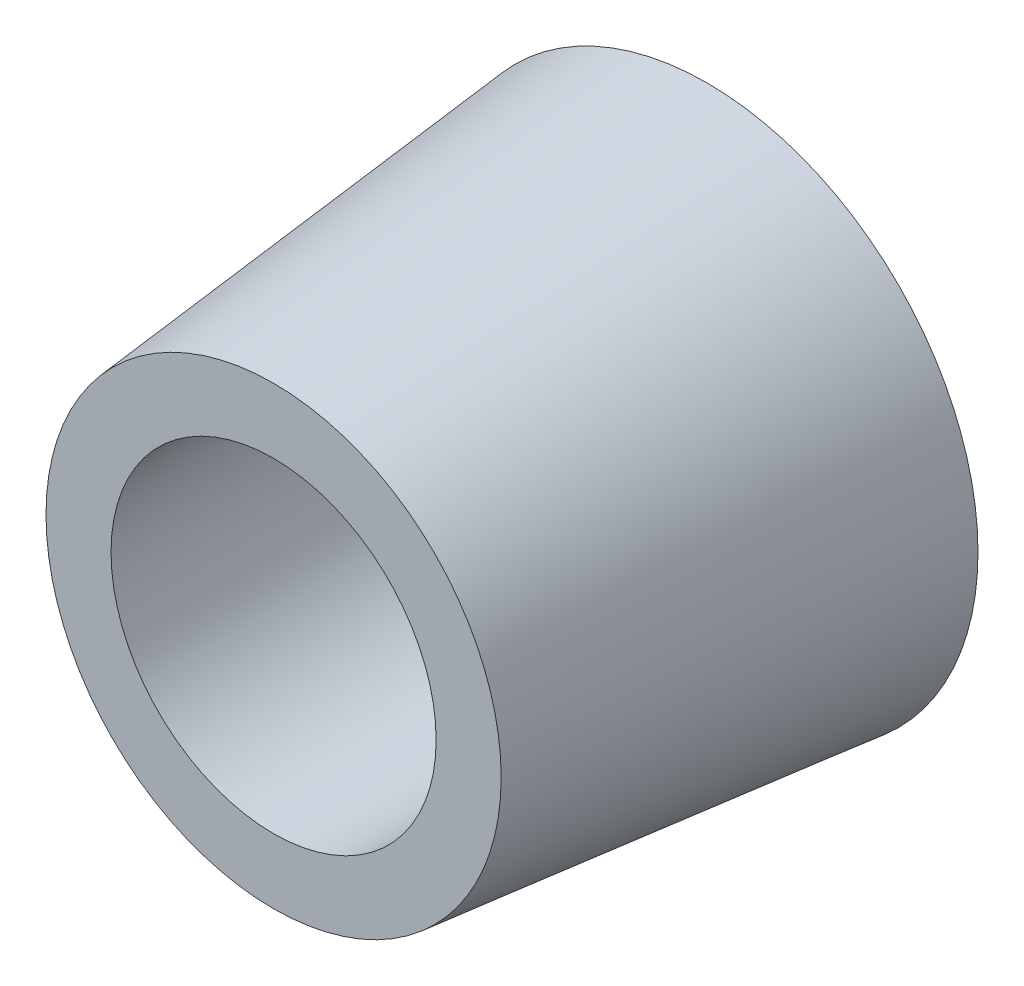
ISO-10303-21;
HEADER;
FILE_DESCRIPTION(('STEP AP214'),'2;1');
FILE_NAME('part.step','',(''),(''),'','','');
FILE_SCHEMA(('AUTOMOTIVE_DESIGN { 1 0 10303 214 1 1 1 1 }'));
ENDSEC;
DATA;
#1=APPLICATION_CONTEXT('core data for automotive mechanical design processes');
#2=APPLICATION_PROTOCOL_DEFINITION('international standard','automotive_design',2000,#1);
#3=PRODUCT_CONTEXT('',#1,'mechanical');
#4=PRODUCT('Part','Part','',(#3));
#5=PRODUCT_RELATED_PRODUCT_CATEGORY('part','',(#4));
#6=PRODUCT_DEFINITION_FORMATION('','',#4);
#7=PRODUCT_DEFINITION_CONTEXT('part definition',#1,'design');
#8=PRODUCT_DEFINITION('design','',#6,#7);
#9=PRODUCT_DEFINITION_SHAPE('','',#8);
#10=(LENGTH_UNIT() NAMED_UNIT(*) SI_UNIT(.MILLI.,.METRE.));
#11=(NAMED_UNIT(*) PLANE_ANGLE_UNIT() SI_UNIT($,.RADIAN.));
#12=(NAMED_UNIT(*) SI_UNIT($,.STERADIAN.) SOLID_ANGLE_UNIT());
#13=UNCERTAINTY_MEASURE_WITH_UNIT(LENGTH_MEASURE(1.E-05),#10,'distance_accuracy_value','');
#14=(GEOMETRIC_REPRESENTATION_CONTEXT(3) GLOBAL_UNCERTAINTY_ASSIGNED_CONTEXT((#13)) GLOBAL_UNIT_ASSIGNED_CONTEXT((#10,
#11,#12)) REPRESENTATION_CONTEXT('',''));
#15=CARTESIAN_POINT('',(0.,0.,0.));
#16=DIRECTION('',(0.,0.,1.));
#17=DIRECTION('',(1.,0.,0.));
#18=AXIS2_PLACEMENT_3D('',#15,#16,#17);
#19=CARTESIAN_POINT('',(0.,0.,4.));
#20=DIRECTION('',(0.,0.,1.));
#21=DIRECTION('',(1.,0.,0.));
#22=AXIS2_PLACEMENT_3D('',#19,#20,#21);
#23=PLANE('',#22);
#24=CARTESIAN_POINT('',(0.,0.,4.));
#25=DIRECTION('',(0.,0.,1.));
#26=DIRECTION('',(1.,0.,0.));
#27=AXIS2_PLACEMENT_3D('',#24,#25,#26);
#28=CIRCLE('',#27,1.5);
#29=CARTESIAN_POINT('',(1.5,0.,4.));
#30=VERTEX_POINT('',#29);
#31=EDGE_CURVE('E105',#30,#30,#28,.T.);
#32=ORIENTED_EDGE('',*,*,#31,.F.);
#33=EDGE_LOOP('',(#32));
#34=FACE_BOUND('',#33,.T.);
#35=CARTESIAN_POINT('',(0.,0.,4.));
#36=DIRECTION('',(0.,0.,1.));
#37=DIRECTION('',(1.,0.,0.));
#38=AXIS2_PLACEMENT_3D('',#35,#36,#37);
#39=CIRCLE('',#38,2.1);
#40=CARTESIAN_POINT('',(2.1,0.,4.));
#41=VERTEX_POINT('',#40);
#42=EDGE_CURVE('E11',#41,#41,#39,.T.);
#43=ORIENTED_EDGE('',*,*,#42,.T.);
#44=EDGE_LOOP('',(#43));
#45=FACE_BOUND('',#44,.T.);
#46=ADVANCED_FACE('F37',(#34,#45),#23,.T.);
#47=CARTESIAN_POINT('',(0.,0.,0.));
#48=DIRECTION('',(0.,0.,1.));
#49=DIRECTION('',(1.,0.,0.));
#50=AXIS2_PLACEMENT_3D('',#47,#48,#49);
#51=PLANE('',#50);
#52=CARTESIAN_POINT('',(0.,0.,0.));
#53=DIRECTION('',(0.,0.,1.));
#54=DIRECTION('',(1.,0.,0.));
#55=AXIS2_PLACEMENT_3D('',#52,#53,#54);
#56=CIRCLE('',#55,1.5);
#57=CARTESIAN_POINT('',(1.5,0.,0.));
#58=VERTEX_POINT('',#57);
#59=EDGE_CURVE('E41',#58,#58,#56,.T.);
#60=ORIENTED_EDGE('',*,*,#59,.T.);
#61=EDGE_LOOP('',(#60));
#62=FACE_BOUND('',#61,.T.);
#63=CARTESIAN_POINT('',(0.,0.,0.));
#64=DIRECTION('',(0.,0.,1.));
#65=DIRECTION('',(1.,0.,0.));
#66=AXIS2_PLACEMENT_3D('',#63,#64,#65);
#67=CIRCLE('',#66,2.5);
#68=CARTESIAN_POINT('',(2.5,0.,0.));
#69=VERTEX_POINT('',#68);
#70=EDGE_CURVE('E45',#69,#69,#67,.T.);
#71=ORIENTED_EDGE('',*,*,#70,.F.);
#72=EDGE_LOOP('',(#71));
#73=FACE_BOUND('',#72,.T.);
#74=ADVANCED_FACE('F70',(#62,#73),#51,.F.);
#75=CARTESIAN_POINT('',(0.,0.,4.));
#76=DIRECTION('',(0.,0.,-1.));
#77=DIRECTION('',(-1.,0.,0.));
#78=AXIS2_PLACEMENT_3D('',#75,#76,#77);
#79=CONICAL_SURFACE('',#78,2.1,0.0996686524911619);
#80=ORIENTED_EDGE('',*,*,#70,.T.);
#81=EDGE_LOOP('',(#80));
#82=FACE_BOUND('',#81,.T.);
#83=ORIENTED_EDGE('',*,*,#42,.F.);
#84=EDGE_LOOP('',(#83));
#85=FACE_BOUND('',#84,.T.);
#86=ADVANCED_FACE('F79',(#82,#85),#79,.T.);
#87=CARTESIAN_POINT('',(0.,0.,-6.));
#88=DIRECTION('',(0.,0.,1.));
#89=DIRECTION('',(1.,0.,0.));
#90=AXIS2_PLACEMENT_3D('',#87,#88,#89);
#91=CYLINDRICAL_SURFACE('',#90,1.5);
#92=ORIENTED_EDGE('',*,*,#31,.T.);
#93=EDGE_LOOP('',(#92));
#94=FACE_BOUND('',#93,.T.);
#95=ORIENTED_EDGE('',*,*,#59,.F.);
#96=EDGE_LOOP('',(#95));
#97=FACE_BOUND('',#96,.T.);
#98=ADVANCED_FACE('F81',(#94,#97),#91,.F.);
#99=CLOSED_SHELL('',(#46,#74,#86,#98));
#100=MANIFOLD_SOLID_BREP('B2',#99);
#101=ADVANCED_BREP_SHAPE_REPRESENTATION('',(#18,#100),#14);
#102=SHAPE_DEFINITION_REPRESENTATION(#9,#101);
ENDSEC;
END-ISO-10303-21;
